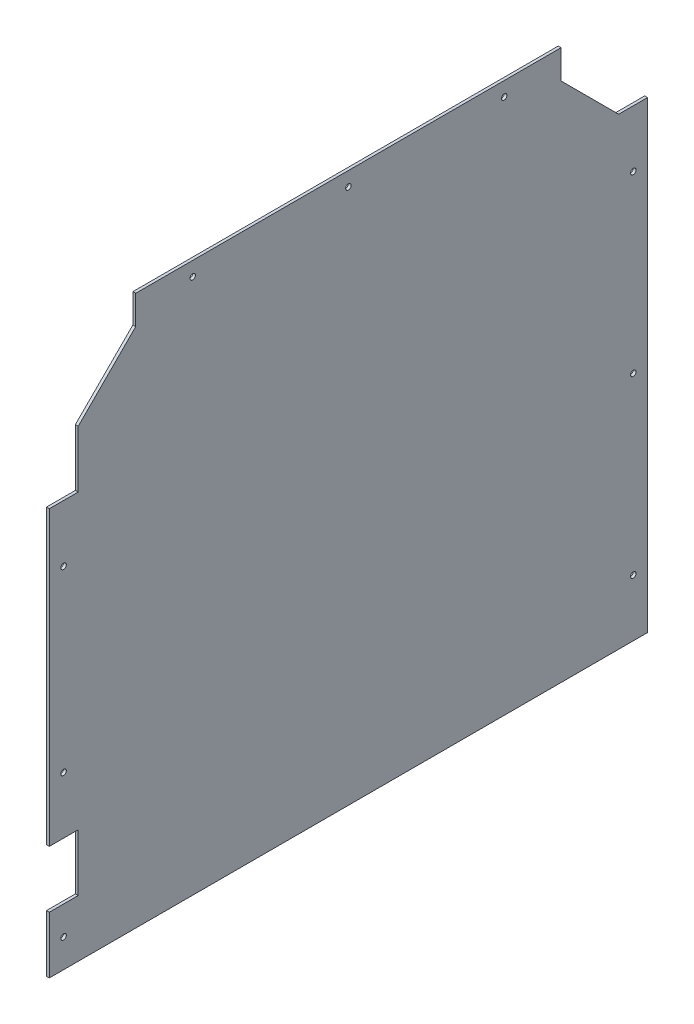
ISO-10303-21;
HEADER;
FILE_DESCRIPTION(('STEP AP214'),'2;1');
FILE_NAME('part.step','',(''),(''),'','','');
FILE_SCHEMA(('AUTOMOTIVE_DESIGN { 1 0 10303 214 1 1 1 1 }'));
ENDSEC;
DATA;
#1=APPLICATION_CONTEXT('core data for automotive mechanical design processes');
#2=APPLICATION_PROTOCOL_DEFINITION('international standard','automotive_design',2000,#1);
#3=PRODUCT_CONTEXT('',#1,'mechanical');
#4=PRODUCT('Part','Part','',(#3));
#5=PRODUCT_RELATED_PRODUCT_CATEGORY('part','',(#4));
#6=PRODUCT_DEFINITION_FORMATION('','',#4);
#7=PRODUCT_DEFINITION_CONTEXT('part definition',#1,'design');
#8=PRODUCT_DEFINITION('design','',#6,#7);
#9=PRODUCT_DEFINITION_SHAPE('','',#8);
#10=(LENGTH_UNIT() NAMED_UNIT(*) SI_UNIT(.MILLI.,.METRE.));
#11=(NAMED_UNIT(*) PLANE_ANGLE_UNIT() SI_UNIT($,.RADIAN.));
#12=(NAMED_UNIT(*) SI_UNIT($,.STERADIAN.) SOLID_ANGLE_UNIT());
#13=UNCERTAINTY_MEASURE_WITH_UNIT(LENGTH_MEASURE(1.E-05),#10,'distance_accuracy_value','');
#14=(GEOMETRIC_REPRESENTATION_CONTEXT(3) GLOBAL_UNCERTAINTY_ASSIGNED_CONTEXT((#13)) GLOBAL_UNIT_ASSIGNED_CONTEXT((#10,
#11,#12)) REPRESENTATION_CONTEXT('',''));
#15=CARTESIAN_POINT('',(0.,0.,0.));
#16=DIRECTION('',(0.,0.,1.));
#17=DIRECTION('',(1.,0.,0.));
#18=AXIS2_PLACEMENT_3D('',#15,#16,#17);
#19=CARTESIAN_POINT('',(1.5,-289.5,315.));
#20=DIRECTION('',(0.,0.,-1.));
#21=DIRECTION('',(-1.,0.,0.));
#22=AXIS2_PLACEMENT_3D('',#19,#20,#21);
#23=PLANE('',#22);
#24=DIRECTION('',(0.,-1.,0.));
#25=VECTOR('',#24,1.);
#26=CARTESIAN_POINT('',(1.5,-289.5,315.));
#27=LINE('',#26,#25);
#28=CARTESIAN_POINT('',(1.5,-229.5,315.));
#29=VERTEX_POINT('',#28);
#30=CARTESIAN_POINT('',(1.5,-289.5,315.));
#31=VERTEX_POINT('',#30);
#32=EDGE_CURVE('E239',#29,#31,#27,.T.);
#33=ORIENTED_EDGE('',*,*,#32,.F.);
#34=DIRECTION('',(-1.,0.,0.));
#35=VECTOR('',#34,1.);
#36=CARTESIAN_POINT('',(1.5,-229.5,315.));
#37=LINE('',#36,#35);
#38=CARTESIAN_POINT('',(-1.5,-229.5,315.));
#39=VERTEX_POINT('',#38);
#40=EDGE_CURVE('E173',#29,#39,#37,.T.);
#41=ORIENTED_EDGE('',*,*,#40,.T.);
#42=DIRECTION('',(0.,-1.,0.));
#43=VECTOR('',#42,1.);
#44=CARTESIAN_POINT('',(-1.5,-289.5,315.));
#45=LINE('',#44,#43);
#46=CARTESIAN_POINT('',(-1.5,-289.5,315.));
#47=VERTEX_POINT('',#46);
#48=EDGE_CURVE('E220',#39,#47,#45,.T.);
#49=ORIENTED_EDGE('',*,*,#48,.T.);
#50=DIRECTION('',(-1.,0.,0.));
#51=VECTOR('',#50,1.);
#52=CARTESIAN_POINT('',(1.5,-289.5,315.));
#53=LINE('',#52,#51);
#54=EDGE_CURVE('E11',#31,#47,#53,.T.);
#55=ORIENTED_EDGE('',*,*,#54,.F.);
#56=EDGE_LOOP('',(#33,#41,#49,#55));
#57=FACE_BOUND('',#56,.T.);
#58=ADVANCED_FACE('F33',(#57),#23,.F.);
#59=CARTESIAN_POINT('',(1.5,138.5,315.));
#60=VERTEX_POINT('',#59);
#61=CARTESIAN_POINT('',(1.5,-169.5,315.));
#62=VERTEX_POINT('',#61);
#63=EDGE_CURVE('E241',#60,#62,#27,.T.);
#64=ORIENTED_EDGE('',*,*,#63,.F.);
#65=DIRECTION('',(-1.,0.,0.));
#66=VECTOR('',#65,1.);
#67=CARTESIAN_POINT('',(1.5,138.5,315.));
#68=LINE('',#67,#66);
#69=CARTESIAN_POINT('',(-1.5,138.5,315.));
#70=VERTEX_POINT('',#69);
#71=EDGE_CURVE('E151',#60,#70,#68,.T.);
#72=ORIENTED_EDGE('',*,*,#71,.T.);
#73=CARTESIAN_POINT('',(-1.5,-169.5,315.));
#74=VERTEX_POINT('',#73);
#75=EDGE_CURVE('E252',#70,#74,#45,.T.);
#76=ORIENTED_EDGE('',*,*,#75,.T.);
#77=DIRECTION('',(-1.,0.,0.));
#78=VECTOR('',#77,1.);
#79=CARTESIAN_POINT('',(1.5,-169.5,315.));
#80=LINE('',#79,#78);
#81=EDGE_CURVE('E48',#62,#74,#80,.T.);
#82=ORIENTED_EDGE('',*,*,#81,.F.);
#83=EDGE_LOOP('',(#64,#72,#76,#82));
#84=FACE_BOUND('',#83,.T.);
#85=ADVANCED_FACE('F35',(#84),#23,.F.);
#86=CARTESIAN_POINT('',(1.5,-289.5,-315.));
#87=DIRECTION('',(0.,1.,0.));
#88=DIRECTION('',(0.,0.,1.));
#89=AXIS2_PLACEMENT_3D('',#86,#87,#88);
#90=PLANE('',#89);
#91=DIRECTION('',(0.,0.,-1.));
#92=VECTOR('',#91,1.);
#93=CARTESIAN_POINT('',(-1.5,-289.5,-315.));
#94=LINE('',#93,#92);
#95=CARTESIAN_POINT('',(-1.5,-289.5,-315.));
#96=VERTEX_POINT('',#95);
#97=EDGE_CURVE('E253',#47,#96,#94,.T.);
#98=ORIENTED_EDGE('',*,*,#97,.T.);
#99=DIRECTION('',(-1.,0.,0.));
#100=VECTOR('',#99,1.);
#101=CARTESIAN_POINT('',(1.5,-289.5,-315.));
#102=LINE('',#101,#100);
#103=CARTESIAN_POINT('',(1.5,-289.5,-315.));
#104=VERTEX_POINT('',#103);
#105=EDGE_CURVE('E41',#104,#96,#102,.T.);
#106=ORIENTED_EDGE('',*,*,#105,.F.);
#107=DIRECTION('',(0.,0.,-1.));
#108=VECTOR('',#107,1.);
#109=CARTESIAN_POINT('',(1.5,-289.5,-315.));
#110=LINE('',#109,#108);
#111=EDGE_CURVE('E243',#31,#104,#110,.T.);
#112=ORIENTED_EDGE('',*,*,#111,.F.);
#113=ORIENTED_EDGE('',*,*,#54,.T.);
#114=EDGE_LOOP('',(#98,#106,#112,#113));
#115=FACE_BOUND('',#114,.T.);
#116=ADVANCED_FACE('F280',(#115),#90,.F.);
#117=CARTESIAN_POINT('',(1.5,-289.5,-315.));
#118=DIRECTION('',(0.,0.,1.));
#119=DIRECTION('',(1.,0.,0.));
#120=AXIS2_PLACEMENT_3D('',#117,#118,#119);
#121=PLANE('',#120);
#122=DIRECTION('',(0.,1.,0.));
#123=VECTOR('',#122,1.);
#124=CARTESIAN_POINT('',(-1.5,-289.5,-315.));
#125=LINE('',#124,#123);
#126=CARTESIAN_POINT('',(-1.5,198.5,-315.));
#127=VERTEX_POINT('',#126);
#128=EDGE_CURVE('E255',#96,#127,#125,.T.);
#129=ORIENTED_EDGE('',*,*,#128,.T.);
#130=DIRECTION('',(-1.,0.,0.));
#131=VECTOR('',#130,1.);
#132=CARTESIAN_POINT('',(1.5,198.5,-315.));
#133=LINE('',#132,#131);
#134=CARTESIAN_POINT('',(1.5,198.5,-315.));
#135=VERTEX_POINT('',#134);
#136=EDGE_CURVE('E56',#135,#127,#133,.T.);
#137=ORIENTED_EDGE('',*,*,#136,.F.);
#138=DIRECTION('',(0.,1.,0.));
#139=VECTOR('',#138,1.);
#140=CARTESIAN_POINT('',(1.5,-289.5,-315.));
#141=LINE('',#140,#139);
#142=EDGE_CURVE('E245',#104,#135,#141,.T.);
#143=ORIENTED_EDGE('',*,*,#142,.F.);
#144=ORIENTED_EDGE('',*,*,#105,.T.);
#145=EDGE_LOOP('',(#129,#137,#143,#144));
#146=FACE_BOUND('',#145,.T.);
#147=ADVANCED_FACE('F264',(#146),#121,.F.);
#148=CARTESIAN_POINT('',(1.5,289.5,-315.));
#149=DIRECTION('',(0.,-1.,0.));
#150=DIRECTION('',(0.,0.,-1.));
#151=AXIS2_PLACEMENT_3D('',#148,#149,#150);
#152=PLANE('',#151);
#153=DIRECTION('',(0.,0.,1.));
#154=VECTOR('',#153,1.);
#155=CARTESIAN_POINT('',(1.5,289.5,-315.));
#156=LINE('',#155,#154);
#157=CARTESIAN_POINT('',(1.5,289.5,-224.));
#158=VERTEX_POINT('',#157);
#159=CARTESIAN_POINT('',(1.5,289.5,224.));
#160=VERTEX_POINT('',#159);
#161=EDGE_CURVE('E248',#158,#160,#156,.T.);
#162=ORIENTED_EDGE('',*,*,#161,.F.);
#163=DIRECTION('',(-1.,0.,0.));
#164=VECTOR('',#163,1.);
#165=CARTESIAN_POINT('',(1.5,289.5,-224.));
#166=LINE('',#165,#164);
#167=CARTESIAN_POINT('',(-1.5,289.5,-224.));
#168=VERTEX_POINT('',#167);
#169=EDGE_CURVE('E217',#158,#168,#166,.T.);
#170=ORIENTED_EDGE('',*,*,#169,.T.);
#171=DIRECTION('',(0.,0.,1.));
#172=VECTOR('',#171,1.);
#173=CARTESIAN_POINT('',(-1.5,289.5,-315.));
#174=LINE('',#173,#172);
#175=CARTESIAN_POINT('',(-1.5,289.5,224.));
#176=VERTEX_POINT('',#175);
#177=EDGE_CURVE('E242',#168,#176,#174,.T.);
#178=ORIENTED_EDGE('',*,*,#177,.T.);
#179=DIRECTION('',(-1.,0.,0.));
#180=VECTOR('',#179,1.);
#181=CARTESIAN_POINT('',(1.5,289.5,224.));
#182=LINE('',#181,#180);
#183=EDGE_CURVE('E230',#160,#176,#182,.T.);
#184=ORIENTED_EDGE('',*,*,#183,.F.);
#185=EDGE_LOOP('',(#162,#170,#178,#184));
#186=FACE_BOUND('',#185,.T.);
#187=ADVANCED_FACE('F378',(#186),#152,.F.);
#188=CARTESIAN_POINT('',(1.5,0.,0.));
#189=DIRECTION('',(1.,0.,0.));
#190=DIRECTION('',(0.,0.,-1.));
#191=AXIS2_PLACEMENT_3D('',#188,#189,#190);
#192=PLANE('',#191);
#193=CARTESIAN_POINT('',(1.5,274.5,-164.));
#194=DIRECTION('',(-1.,0.,0.));
#195=DIRECTION('',(0.,0.,1.));
#196=AXIS2_PLACEMENT_3D('',#193,#194,#195);
#197=CIRCLE('',#196,2.90000000000001);
#198=CARTESIAN_POINT('',(1.5,274.5,-161.1));
#199=VERTEX_POINT('',#198);
#200=EDGE_CURVE('E535',#199,#199,#197,.T.);
#201=ORIENTED_EDGE('',*,*,#200,.T.);
#202=EDGE_LOOP('',(#201));
#203=FACE_BOUND('',#202,.T.);
#204=CARTESIAN_POINT('',(1.5,274.5,0.));
#205=DIRECTION('',(-1.,0.,0.));
#206=DIRECTION('',(0.,0.,1.));
#207=AXIS2_PLACEMENT_3D('',#204,#205,#206);
#208=CIRCLE('',#207,2.90000000000001);
#209=CARTESIAN_POINT('',(1.5,274.5,2.90000000000001));
#210=VERTEX_POINT('',#209);
#211=EDGE_CURVE('E545',#210,#210,#208,.T.);
#212=ORIENTED_EDGE('',*,*,#211,.T.);
#213=EDGE_LOOP('',(#212));
#214=FACE_BOUND('',#213,.T.);
#215=CARTESIAN_POINT('',(1.5,274.5,164.));
#216=DIRECTION('',(-1.,0.,0.));
#217=DIRECTION('',(0.,0.,1.));
#218=AXIS2_PLACEMENT_3D('',#215,#216,#217);
#219=CIRCLE('',#218,2.90000000000001);
#220=CARTESIAN_POINT('',(1.5,274.5,166.9));
#221=VERTEX_POINT('',#220);
#222=EDGE_CURVE('E551',#221,#221,#219,.T.);
#223=ORIENTED_EDGE('',*,*,#222,.T.);
#224=EDGE_LOOP('',(#223));
#225=FACE_BOUND('',#224,.T.);
#226=CARTESIAN_POINT('',(1.5,78.4999999999999,300.));
#227=DIRECTION('',(-1.,0.,0.));
#228=DIRECTION('',(0.,0.,1.));
#229=AXIS2_PLACEMENT_3D('',#226,#227,#228);
#230=CIRCLE('',#229,2.9);
#231=CARTESIAN_POINT('',(1.5,78.4999999999999,302.9));
#232=VERTEX_POINT('',#231);
#233=EDGE_CURVE('E557',#232,#232,#230,.T.);
#234=ORIENTED_EDGE('',*,*,#233,.T.);
#235=EDGE_LOOP('',(#234));
#236=FACE_BOUND('',#235,.T.);
#237=CARTESIAN_POINT('',(1.5,-109.5,300.));
#238=DIRECTION('',(-1.,0.,0.));
#239=DIRECTION('',(0.,0.,1.));
#240=AXIS2_PLACEMENT_3D('',#237,#238,#239);
#241=CIRCLE('',#240,2.9);
#242=CARTESIAN_POINT('',(1.5,-109.5,302.9));
#243=VERTEX_POINT('',#242);
#244=EDGE_CURVE('E563',#243,#243,#241,.T.);
#245=ORIENTED_EDGE('',*,*,#244,.T.);
#246=EDGE_LOOP('',(#245));
#247=FACE_BOUND('',#246,.T.);
#248=CARTESIAN_POINT('',(1.5,-259.5,300.));
#249=DIRECTION('',(-1.,0.,0.));
#250=DIRECTION('',(0.,0.,1.));
#251=AXIS2_PLACEMENT_3D('',#248,#249,#250);
#252=CIRCLE('',#251,2.90000000000001);
#253=CARTESIAN_POINT('',(1.5,-259.5,302.9));
#254=VERTEX_POINT('',#253);
#255=EDGE_CURVE('E569',#254,#254,#252,.T.);
#256=ORIENTED_EDGE('',*,*,#255,.T.);
#257=EDGE_LOOP('',(#256));
#258=FACE_BOUND('',#257,.T.);
#259=CARTESIAN_POINT('',(1.5,-229.5,-300.));
#260=DIRECTION('',(-1.,0.,0.));
#261=DIRECTION('',(0.,0.,1.));
#262=AXIS2_PLACEMENT_3D('',#259,#260,#261);
#263=CIRCLE('',#262,2.89999999999999);
#264=CARTESIAN_POINT('',(1.5,-229.5,-297.1));
#265=VERTEX_POINT('',#264);
#266=EDGE_CURVE('E575',#265,#265,#263,.T.);
#267=ORIENTED_EDGE('',*,*,#266,.T.);
#268=EDGE_LOOP('',(#267));
#269=FACE_BOUND('',#268,.T.);
#270=CARTESIAN_POINT('',(1.5,-45.5,-300.));
#271=DIRECTION('',(-1.,0.,0.));
#272=DIRECTION('',(0.,0.,1.));
#273=AXIS2_PLACEMENT_3D('',#270,#271,#272);
#274=CIRCLE('',#273,2.9);
#275=CARTESIAN_POINT('',(1.5,-45.5,-297.1));
#276=VERTEX_POINT('',#275);
#277=EDGE_CURVE('E581',#276,#276,#274,.T.);
#278=ORIENTED_EDGE('',*,*,#277,.T.);
#279=EDGE_LOOP('',(#278));
#280=FACE_BOUND('',#279,.T.);
#281=CARTESIAN_POINT('',(1.5,138.5,-300.));
#282=DIRECTION('',(-1.,0.,0.));
#283=DIRECTION('',(0.,0.,1.));
#284=AXIS2_PLACEMENT_3D('',#281,#282,#283);
#285=CIRCLE('',#284,2.89999999999999);
#286=CARTESIAN_POINT('',(1.5,138.5,-297.1));
#287=VERTEX_POINT('',#286);
#288=EDGE_CURVE('E170',#287,#287,#285,.T.);
#289=ORIENTED_EDGE('',*,*,#288,.T.);
#290=EDGE_LOOP('',(#289));
#291=FACE_BOUND('',#290,.T.);
#292=DIRECTION('',(0.,-1.,0.));
#293=VECTOR('',#292,1.);
#294=CARTESIAN_POINT('',(1.5,198.5,284.585786437627));
#295=LINE('',#294,#293);
#296=CARTESIAN_POINT('',(1.5,198.5,284.585786437627));
#297=VERTEX_POINT('',#296);
#298=CARTESIAN_POINT('',(1.5,138.5,284.585786437627));
#299=VERTEX_POINT('',#298);
#300=EDGE_CURVE('E145',#297,#299,#295,.T.);
#301=ORIENTED_EDGE('',*,*,#300,.T.);
#302=DIRECTION('',(0.,0.,1.));
#303=VECTOR('',#302,1.);
#304=CARTESIAN_POINT('',(1.5,138.5,284.585786437627));
#305=LINE('',#304,#303);
#306=EDGE_CURVE('E152',#299,#60,#305,.T.);
#307=ORIENTED_EDGE('',*,*,#306,.T.);
#308=ORIENTED_EDGE('',*,*,#63,.T.);
#309=DIRECTION('',(0.,0.,-1.));
#310=VECTOR('',#309,1.);
#311=CARTESIAN_POINT('',(1.5,-169.5,315.));
#312=LINE('',#311,#310);
#313=CARTESIAN_POINT('',(1.5,-169.5,284.585786437627));
#314=VERTEX_POINT('',#313);
#315=EDGE_CURVE('E177',#62,#314,#312,.T.);
#316=ORIENTED_EDGE('',*,*,#315,.T.);
#317=DIRECTION('',(0.,-1.,0.));
#318=VECTOR('',#317,1.);
#319=CARTESIAN_POINT('',(1.5,-169.5,284.585786437627));
#320=LINE('',#319,#318);
#321=CARTESIAN_POINT('',(1.5,-229.5,284.585786437627));
#322=VERTEX_POINT('',#321);
#323=EDGE_CURVE('E180',#314,#322,#320,.T.);
#324=ORIENTED_EDGE('',*,*,#323,.T.);
#325=DIRECTION('',(0.,0.,1.));
#326=VECTOR('',#325,1.);
#327=CARTESIAN_POINT('',(1.5,-229.5,315.));
#328=LINE('',#327,#326);
#329=EDGE_CURVE('E184',#322,#29,#328,.T.);
#330=ORIENTED_EDGE('',*,*,#329,.T.);
#331=ORIENTED_EDGE('',*,*,#32,.T.);
#332=ORIENTED_EDGE('',*,*,#111,.T.);
#333=ORIENTED_EDGE('',*,*,#142,.T.);
#334=DIRECTION('',(0.,0.,1.));
#335=VECTOR('',#334,1.);
#336=CARTESIAN_POINT('',(1.5,198.5,-284.585786437627));
#337=LINE('',#336,#335);
#338=CARTESIAN_POINT('',(1.5,198.5,-284.585786437627));
#339=VERTEX_POINT('',#338);
#340=EDGE_CURVE('E200',#135,#339,#337,.T.);
#341=ORIENTED_EDGE('',*,*,#340,.T.);
#342=DIRECTION('',(0.,0.707106781186547,0.707106781186547));
#343=VECTOR('',#342,1.);
#344=CARTESIAN_POINT('',(1.5,259.085786437627,-224.));
#345=LINE('',#344,#343);
#346=CARTESIAN_POINT('',(1.5,259.085786437627,-224.));
#347=VERTEX_POINT('',#346);
#348=EDGE_CURVE('E203',#339,#347,#345,.T.);
#349=ORIENTED_EDGE('',*,*,#348,.T.);
#350=DIRECTION('',(0.,1.,0.));
#351=VECTOR('',#350,1.);
#352=CARTESIAN_POINT('',(1.5,289.5,-224.));
#353=LINE('',#352,#351);
#354=EDGE_CURVE('E207',#347,#158,#353,.T.);
#355=ORIENTED_EDGE('',*,*,#354,.T.);
#356=ORIENTED_EDGE('',*,*,#161,.T.);
#357=DIRECTION('',(0.,-1.,0.));
#358=VECTOR('',#357,1.);
#359=CARTESIAN_POINT('',(1.5,289.5,224.));
#360=LINE('',#359,#358);
#361=CARTESIAN_POINT('',(1.5,259.085786437627,224.));
#362=VERTEX_POINT('',#361);
#363=EDGE_CURVE('E226',#160,#362,#360,.T.);
#364=ORIENTED_EDGE('',*,*,#363,.T.);
#365=DIRECTION('',(0.,-0.707106781186547,0.707106781186548));
#366=VECTOR('',#365,1.);
#367=CARTESIAN_POINT('',(1.5,259.085786437627,224.));
#368=LINE('',#367,#366);
#369=EDGE_CURVE('E165',#362,#297,#368,.T.);
#370=ORIENTED_EDGE('',*,*,#369,.T.);
#371=EDGE_LOOP('',(#301,#307,#308,#316,#324,#330,#331,#332,#333,#341,#349,#355,#356,#364,#370));
#372=FACE_BOUND('',#371,.T.);
#373=ADVANCED_FACE('F162',(#203,#214,#225,#236,#247,#258,#269,#280,#291,#372),#192,.T.);
#374=CARTESIAN_POINT('',(-1.5,0.,0.));
#375=DIRECTION('',(1.,0.,0.));
#376=DIRECTION('',(0.,0.,-1.));
#377=AXIS2_PLACEMENT_3D('',#374,#375,#376);
#378=PLANE('',#377);
#379=CARTESIAN_POINT('',(-1.5,274.5,-164.));
#380=DIRECTION('',(-1.,0.,0.));
#381=DIRECTION('',(0.,0.,1.));
#382=AXIS2_PLACEMENT_3D('',#379,#380,#381);
#383=CIRCLE('',#382,2.90000000000001);
#384=CARTESIAN_POINT('',(-1.5,274.5,-161.1));
#385=VERTEX_POINT('',#384);
#386=EDGE_CURVE('E538',#385,#385,#383,.T.);
#387=ORIENTED_EDGE('',*,*,#386,.F.);
#388=EDGE_LOOP('',(#387));
#389=FACE_BOUND('',#388,.T.);
#390=CARTESIAN_POINT('',(-1.5,274.5,0.));
#391=DIRECTION('',(-1.,0.,0.));
#392=DIRECTION('',(0.,0.,1.));
#393=AXIS2_PLACEMENT_3D('',#390,#391,#392);
#394=CIRCLE('',#393,2.90000000000001);
#395=CARTESIAN_POINT('',(-1.5,274.5,2.90000000000001));
#396=VERTEX_POINT('',#395);
#397=EDGE_CURVE('E540',#396,#396,#394,.T.);
#398=ORIENTED_EDGE('',*,*,#397,.F.);
#399=EDGE_LOOP('',(#398));
#400=FACE_BOUND('',#399,.T.);
#401=CARTESIAN_POINT('',(-1.5,274.5,164.));
#402=DIRECTION('',(-1.,0.,0.));
#403=DIRECTION('',(0.,0.,1.));
#404=AXIS2_PLACEMENT_3D('',#401,#402,#403);
#405=CIRCLE('',#404,2.90000000000001);
#406=CARTESIAN_POINT('',(-1.5,274.5,166.9));
#407=VERTEX_POINT('',#406);
#408=EDGE_CURVE('E548',#407,#407,#405,.T.);
#409=ORIENTED_EDGE('',*,*,#408,.F.);
#410=EDGE_LOOP('',(#409));
#411=FACE_BOUND('',#410,.T.);
#412=CARTESIAN_POINT('',(-1.5,78.4999999999999,300.));
#413=DIRECTION('',(-1.,0.,0.));
#414=DIRECTION('',(0.,0.,1.));
#415=AXIS2_PLACEMENT_3D('',#412,#413,#414);
#416=CIRCLE('',#415,2.9);
#417=CARTESIAN_POINT('',(-1.5,78.4999999999999,302.9));
#418=VERTEX_POINT('',#417);
#419=EDGE_CURVE('E554',#418,#418,#416,.T.);
#420=ORIENTED_EDGE('',*,*,#419,.F.);
#421=EDGE_LOOP('',(#420));
#422=FACE_BOUND('',#421,.T.);
#423=CARTESIAN_POINT('',(-1.5,-109.5,300.));
#424=DIRECTION('',(-1.,0.,0.));
#425=DIRECTION('',(0.,0.,1.));
#426=AXIS2_PLACEMENT_3D('',#423,#424,#425);
#427=CIRCLE('',#426,2.9);
#428=CARTESIAN_POINT('',(-1.5,-109.5,302.9));
#429=VERTEX_POINT('',#428);
#430=EDGE_CURVE('E560',#429,#429,#427,.T.);
#431=ORIENTED_EDGE('',*,*,#430,.F.);
#432=EDGE_LOOP('',(#431));
#433=FACE_BOUND('',#432,.T.);
#434=CARTESIAN_POINT('',(-1.5,-259.5,300.));
#435=DIRECTION('',(-1.,0.,0.));
#436=DIRECTION('',(0.,0.,1.));
#437=AXIS2_PLACEMENT_3D('',#434,#435,#436);
#438=CIRCLE('',#437,2.90000000000001);
#439=CARTESIAN_POINT('',(-1.5,-259.5,302.9));
#440=VERTEX_POINT('',#439);
#441=EDGE_CURVE('E566',#440,#440,#438,.T.);
#442=ORIENTED_EDGE('',*,*,#441,.F.);
#443=EDGE_LOOP('',(#442));
#444=FACE_BOUND('',#443,.T.);
#445=CARTESIAN_POINT('',(-1.5,-229.5,-300.));
#446=DIRECTION('',(-1.,0.,0.));
#447=DIRECTION('',(0.,0.,1.));
#448=AXIS2_PLACEMENT_3D('',#445,#446,#447);
#449=CIRCLE('',#448,2.89999999999999);
#450=CARTESIAN_POINT('',(-1.5,-229.5,-297.1));
#451=VERTEX_POINT('',#450);
#452=EDGE_CURVE('E572',#451,#451,#449,.T.);
#453=ORIENTED_EDGE('',*,*,#452,.F.);
#454=EDGE_LOOP('',(#453));
#455=FACE_BOUND('',#454,.T.);
#456=CARTESIAN_POINT('',(-1.5,-45.5,-300.));
#457=DIRECTION('',(-1.,0.,0.));
#458=DIRECTION('',(0.,0.,1.));
#459=AXIS2_PLACEMENT_3D('',#456,#457,#458);
#460=CIRCLE('',#459,2.9);
#461=CARTESIAN_POINT('',(-1.5,-45.5,-297.1));
#462=VERTEX_POINT('',#461);
#463=EDGE_CURVE('E578',#462,#462,#460,.T.);
#464=ORIENTED_EDGE('',*,*,#463,.F.);
#465=EDGE_LOOP('',(#464));
#466=FACE_BOUND('',#465,.T.);
#467=CARTESIAN_POINT('',(-1.5,138.5,-300.));
#468=DIRECTION('',(-1.,0.,0.));
#469=DIRECTION('',(0.,0.,1.));
#470=AXIS2_PLACEMENT_3D('',#467,#468,#469);
#471=CIRCLE('',#470,2.89999999999999);
#472=CARTESIAN_POINT('',(-1.5,138.5,-297.1));
#473=VERTEX_POINT('',#472);
#474=EDGE_CURVE('E583',#473,#473,#471,.T.);
#475=ORIENTED_EDGE('',*,*,#474,.F.);
#476=EDGE_LOOP('',(#475));
#477=FACE_BOUND('',#476,.T.);
#478=DIRECTION('',(0.,0.,1.));
#479=VECTOR('',#478,1.);
#480=CARTESIAN_POINT('',(-1.5,138.5,284.585786437627));
#481=LINE('',#480,#479);
#482=CARTESIAN_POINT('',(-1.5,138.5,284.585786437627));
#483=VERTEX_POINT('',#482);
#484=EDGE_CURVE('E166',#483,#70,#481,.T.);
#485=ORIENTED_EDGE('',*,*,#484,.F.);
#486=DIRECTION('',(0.,-1.,0.));
#487=VECTOR('',#486,1.);
#488=CARTESIAN_POINT('',(-1.5,198.5,284.585786437627));
#489=LINE('',#488,#487);
#490=CARTESIAN_POINT('',(-1.5,198.5,284.585786437627));
#491=VERTEX_POINT('',#490);
#492=EDGE_CURVE('E148',#491,#483,#489,.T.);
#493=ORIENTED_EDGE('',*,*,#492,.F.);
#494=DIRECTION('',(0.,-0.707106781186547,0.707106781186548));
#495=VECTOR('',#494,1.);
#496=CARTESIAN_POINT('',(-1.5,259.085786437627,224.));
#497=LINE('',#496,#495);
#498=CARTESIAN_POINT('',(-1.5,259.085786437627,224.));
#499=VERTEX_POINT('',#498);
#500=EDGE_CURVE('E228',#499,#491,#497,.T.);
#501=ORIENTED_EDGE('',*,*,#500,.F.);
#502=DIRECTION('',(0.,-1.,0.));
#503=VECTOR('',#502,1.);
#504=CARTESIAN_POINT('',(-1.5,289.5,224.));
#505=LINE('',#504,#503);
#506=EDGE_CURVE('E175',#176,#499,#505,.T.);
#507=ORIENTED_EDGE('',*,*,#506,.F.);
#508=ORIENTED_EDGE('',*,*,#177,.F.);
#509=DIRECTION('',(0.,1.,0.));
#510=VECTOR('',#509,1.);
#511=CARTESIAN_POINT('',(-1.5,289.5,-224.));
#512=LINE('',#511,#510);
#513=CARTESIAN_POINT('',(-1.5,259.085786437627,-224.));
#514=VERTEX_POINT('',#513);
#515=EDGE_CURVE('E204',#514,#168,#512,.T.);
#516=ORIENTED_EDGE('',*,*,#515,.F.);
#517=DIRECTION('',(0.,0.707106781186547,0.707106781186547));
#518=VECTOR('',#517,1.);
#519=CARTESIAN_POINT('',(-1.5,259.085786437627,-224.));
#520=LINE('',#519,#518);
#521=CARTESIAN_POINT('',(-1.5,198.5,-284.585786437627));
#522=VERTEX_POINT('',#521);
#523=EDGE_CURVE('E212',#522,#514,#520,.T.);
#524=ORIENTED_EDGE('',*,*,#523,.F.);
#525=DIRECTION('',(0.,0.,1.));
#526=VECTOR('',#525,1.);
#527=CARTESIAN_POINT('',(-1.5,198.5,-284.585786437627));
#528=LINE('',#527,#526);
#529=EDGE_CURVE('E210',#127,#522,#528,.T.);
#530=ORIENTED_EDGE('',*,*,#529,.F.);
#531=ORIENTED_EDGE('',*,*,#128,.F.);
#532=ORIENTED_EDGE('',*,*,#97,.F.);
#533=ORIENTED_EDGE('',*,*,#48,.F.);
#534=DIRECTION('',(0.,0.,1.));
#535=VECTOR('',#534,1.);
#536=CARTESIAN_POINT('',(-1.5,-229.5,315.));
#537=LINE('',#536,#535);
#538=CARTESIAN_POINT('',(-1.5,-229.5,284.585786437627));
#539=VERTEX_POINT('',#538);
#540=EDGE_CURVE('E181',#539,#39,#537,.T.);
#541=ORIENTED_EDGE('',*,*,#540,.F.);
#542=DIRECTION('',(0.,-1.,0.));
#543=VECTOR('',#542,1.);
#544=CARTESIAN_POINT('',(-1.5,-169.5,284.585786437627));
#545=LINE('',#544,#543);
#546=CARTESIAN_POINT('',(-1.5,-169.5,284.585786437627));
#547=VERTEX_POINT('',#546);
#548=EDGE_CURVE('E189',#547,#539,#545,.T.);
#549=ORIENTED_EDGE('',*,*,#548,.F.);
#550=DIRECTION('',(0.,0.,-1.));
#551=VECTOR('',#550,1.);
#552=CARTESIAN_POINT('',(-1.5,-169.5,315.));
#553=LINE('',#552,#551);
#554=EDGE_CURVE('E187',#74,#547,#553,.T.);
#555=ORIENTED_EDGE('',*,*,#554,.F.);
#556=ORIENTED_EDGE('',*,*,#75,.F.);
#557=EDGE_LOOP('',(#485,#493,#501,#507,#508,#516,#524,#530,#531,#532,#533,#541,#549,#555,#556));
#558=FACE_BOUND('',#557,.T.);
#559=ADVANCED_FACE('F269',(#389,#400,#411,#422,#433,#444,#455,#466,#477,#558),#378,.F.);
#560=CARTESIAN_POINT('',(1.5,259.085786437627,224.));
#561=DIRECTION('',(0.,-0.707106781186548,-0.707106781186547));
#562=DIRECTION('',(0.,0.707106781186547,-0.707106781186548));
#563=AXIS2_PLACEMENT_3D('',#560,#561,#562);
#564=PLANE('',#563);
#565=ORIENTED_EDGE('',*,*,#500,.T.);
#566=DIRECTION('',(-1.,0.,0.));
#567=VECTOR('',#566,1.);
#568=CARTESIAN_POINT('',(1.5,198.5,284.585786437627));
#569=LINE('',#568,#567);
#570=EDGE_CURVE('E213',#297,#491,#569,.T.);
#571=ORIENTED_EDGE('',*,*,#570,.F.);
#572=ORIENTED_EDGE('',*,*,#369,.F.);
#573=DIRECTION('',(-1.,0.,0.));
#574=VECTOR('',#573,1.);
#575=CARTESIAN_POINT('',(1.5,259.085786437627,224.));
#576=LINE('',#575,#574);
#577=EDGE_CURVE('E236',#362,#499,#576,.T.);
#578=ORIENTED_EDGE('',*,*,#577,.T.);
#579=EDGE_LOOP('',(#565,#571,#572,#578));
#580=FACE_BOUND('',#579,.T.);
#581=ADVANCED_FACE('F317',(#580),#564,.F.);
#582=CARTESIAN_POINT('',(1.5,289.5,224.));
#583=DIRECTION('',(0.,0.,-1.));
#584=DIRECTION('',(-1.,0.,0.));
#585=AXIS2_PLACEMENT_3D('',#582,#583,#584);
#586=PLANE('',#585);
#587=ORIENTED_EDGE('',*,*,#506,.T.);
#588=ORIENTED_EDGE('',*,*,#577,.F.);
#589=ORIENTED_EDGE('',*,*,#363,.F.);
#590=ORIENTED_EDGE('',*,*,#183,.T.);
#591=EDGE_LOOP('',(#587,#588,#589,#590));
#592=FACE_BOUND('',#591,.T.);
#593=ADVANCED_FACE('F322',(#592),#586,.F.);
#594=CARTESIAN_POINT('',(1.5,289.5,-224.));
#595=DIRECTION('',(0.,0.,1.));
#596=DIRECTION('',(1.,0.,0.));
#597=AXIS2_PLACEMENT_3D('',#594,#595,#596);
#598=PLANE('',#597);
#599=ORIENTED_EDGE('',*,*,#515,.T.);
#600=ORIENTED_EDGE('',*,*,#169,.F.);
#601=ORIENTED_EDGE('',*,*,#354,.F.);
#602=DIRECTION('',(-1.,0.,0.));
#603=VECTOR('',#602,1.);
#604=CARTESIAN_POINT('',(1.5,259.085786437627,-224.));
#605=LINE('',#604,#603);
#606=EDGE_CURVE('E221',#347,#514,#605,.T.);
#607=ORIENTED_EDGE('',*,*,#606,.T.);
#608=EDGE_LOOP('',(#599,#600,#601,#607));
#609=FACE_BOUND('',#608,.T.);
#610=ADVANCED_FACE('F482',(#609),#598,.F.);
#611=CARTESIAN_POINT('',(1.5,259.085786437627,-224.));
#612=DIRECTION('',(0.,-0.707106781186548,0.707106781186548));
#613=DIRECTION('',(0.,-0.707106781186548,-0.707106781186548));
#614=AXIS2_PLACEMENT_3D('',#611,#612,#613);
#615=PLANE('',#614);
#616=ORIENTED_EDGE('',*,*,#523,.T.);
#617=ORIENTED_EDGE('',*,*,#606,.F.);
#618=ORIENTED_EDGE('',*,*,#348,.F.);
#619=DIRECTION('',(-1.,0.,0.));
#620=VECTOR('',#619,1.);
#621=CARTESIAN_POINT('',(1.5,198.5,-284.585786437627));
#622=LINE('',#621,#620);
#623=EDGE_CURVE('E223',#339,#522,#622,.T.);
#624=ORIENTED_EDGE('',*,*,#623,.T.);
#625=EDGE_LOOP('',(#616,#617,#618,#624));
#626=FACE_BOUND('',#625,.T.);
#627=ADVANCED_FACE('F276',(#626),#615,.F.);
#628=CARTESIAN_POINT('',(1.5,198.5,-284.585786437627));
#629=DIRECTION('',(0.,-1.,0.));
#630=DIRECTION('',(0.,0.,-1.));
#631=AXIS2_PLACEMENT_3D('',#628,#629,#630);
#632=PLANE('',#631);
#633=ORIENTED_EDGE('',*,*,#529,.T.);
#634=ORIENTED_EDGE('',*,*,#623,.F.);
#635=ORIENTED_EDGE('',*,*,#340,.F.);
#636=ORIENTED_EDGE('',*,*,#136,.T.);
#637=EDGE_LOOP('',(#633,#634,#635,#636));
#638=FACE_BOUND('',#637,.T.);
#639=ADVANCED_FACE('F273',(#638),#632,.F.);
#640=CARTESIAN_POINT('',(1.5,198.5,284.585786437627));
#641=DIRECTION('',(0.,0.,-1.));
#642=DIRECTION('',(-1.,0.,0.));
#643=AXIS2_PLACEMENT_3D('',#640,#641,#642);
#644=PLANE('',#643);
#645=ORIENTED_EDGE('',*,*,#492,.T.);
#646=DIRECTION('',(-1.,0.,0.));
#647=VECTOR('',#646,1.);
#648=CARTESIAN_POINT('',(1.5,138.5,284.585786437627));
#649=LINE('',#648,#647);
#650=EDGE_CURVE('E141',#299,#483,#649,.T.);
#651=ORIENTED_EDGE('',*,*,#650,.F.);
#652=ORIENTED_EDGE('',*,*,#300,.F.);
#653=ORIENTED_EDGE('',*,*,#570,.T.);
#654=EDGE_LOOP('',(#645,#651,#652,#653));
#655=FACE_BOUND('',#654,.T.);
#656=ADVANCED_FACE('F143',(#655),#644,.F.);
#657=CARTESIAN_POINT('',(1.5,138.5,284.585786437627));
#658=DIRECTION('',(0.,-1.,0.));
#659=DIRECTION('',(0.,0.,-1.));
#660=AXIS2_PLACEMENT_3D('',#657,#658,#659);
#661=PLANE('',#660);
#662=ORIENTED_EDGE('',*,*,#484,.T.);
#663=ORIENTED_EDGE('',*,*,#71,.F.);
#664=ORIENTED_EDGE('',*,*,#306,.F.);
#665=ORIENTED_EDGE('',*,*,#650,.T.);
#666=EDGE_LOOP('',(#662,#663,#664,#665));
#667=FACE_BOUND('',#666,.T.);
#668=ADVANCED_FACE('F155',(#667),#661,.F.);
#669=CARTESIAN_POINT('',(1.5,-229.5,315.));
#670=DIRECTION('',(0.,-1.,0.));
#671=DIRECTION('',(0.,0.,-1.));
#672=AXIS2_PLACEMENT_3D('',#669,#670,#671);
#673=PLANE('',#672);
#674=ORIENTED_EDGE('',*,*,#540,.T.);
#675=ORIENTED_EDGE('',*,*,#40,.F.);
#676=ORIENTED_EDGE('',*,*,#329,.F.);
#677=DIRECTION('',(-1.,0.,0.));
#678=VECTOR('',#677,1.);
#679=CARTESIAN_POINT('',(1.5,-229.5,284.585786437627));
#680=LINE('',#679,#678);
#681=EDGE_CURVE('E195',#322,#539,#680,.T.);
#682=ORIENTED_EDGE('',*,*,#681,.T.);
#683=EDGE_LOOP('',(#674,#675,#676,#682));
#684=FACE_BOUND('',#683,.T.);
#685=ADVANCED_FACE('F285',(#684),#673,.F.);
#686=CARTESIAN_POINT('',(1.5,-169.5,284.585786437627));
#687=DIRECTION('',(0.,0.,-1.));
#688=DIRECTION('',(-1.,0.,0.));
#689=AXIS2_PLACEMENT_3D('',#686,#687,#688);
#690=PLANE('',#689);
#691=ORIENTED_EDGE('',*,*,#548,.T.);
#692=ORIENTED_EDGE('',*,*,#681,.F.);
#693=ORIENTED_EDGE('',*,*,#323,.F.);
#694=DIRECTION('',(-1.,0.,0.));
#695=VECTOR('',#694,1.);
#696=CARTESIAN_POINT('',(1.5,-169.5,284.585786437627));
#697=LINE('',#696,#695);
#698=EDGE_CURVE('E197',#314,#547,#697,.T.);
#699=ORIENTED_EDGE('',*,*,#698,.T.);
#700=EDGE_LOOP('',(#691,#692,#693,#699));
#701=FACE_BOUND('',#700,.T.);
#702=ADVANCED_FACE('F289',(#701),#690,.F.);
#703=CARTESIAN_POINT('',(1.5,-169.5,315.));
#704=DIRECTION('',(0.,1.,0.));
#705=DIRECTION('',(0.,0.,1.));
#706=AXIS2_PLACEMENT_3D('',#703,#704,#705);
#707=PLANE('',#706);
#708=ORIENTED_EDGE('',*,*,#554,.T.);
#709=ORIENTED_EDGE('',*,*,#698,.F.);
#710=ORIENTED_EDGE('',*,*,#315,.F.);
#711=ORIENTED_EDGE('',*,*,#81,.T.);
#712=EDGE_LOOP('',(#708,#709,#710,#711));
#713=FACE_BOUND('',#712,.T.);
#714=ADVANCED_FACE('F290',(#713),#707,.F.);
#715=CARTESIAN_POINT('',(-1.5,138.5,-300.));
#716=DIRECTION('',(-1.,0.,0.));
#717=DIRECTION('',(0.,0.,1.));
#718=AXIS2_PLACEMENT_3D('',#715,#716,#717);
#719=CYLINDRICAL_SURFACE('',#718,2.89999999999999);
#720=ORIENTED_EDGE('',*,*,#288,.F.);
#721=EDGE_LOOP('',(#720));
#722=FACE_BOUND('',#721,.T.);
#723=ORIENTED_EDGE('',*,*,#474,.T.);
#724=EDGE_LOOP('',(#723));
#725=FACE_BOUND('',#724,.T.);
#726=ADVANCED_FACE('F367',(#722,#725),#719,.F.);
#727=CARTESIAN_POINT('',(-1.5,-45.5,-300.));
#728=DIRECTION('',(-1.,0.,0.));
#729=DIRECTION('',(0.,0.,1.));
#730=AXIS2_PLACEMENT_3D('',#727,#728,#729);
#731=CYLINDRICAL_SURFACE('',#730,2.9);
#732=ORIENTED_EDGE('',*,*,#277,.F.);
#733=EDGE_LOOP('',(#732));
#734=FACE_BOUND('',#733,.T.);
#735=ORIENTED_EDGE('',*,*,#463,.T.);
#736=EDGE_LOOP('',(#735));
#737=FACE_BOUND('',#736,.T.);
#738=ADVANCED_FACE('F395',(#734,#737),#731,.F.);
#739=CARTESIAN_POINT('',(-1.5,-229.5,-300.));
#740=DIRECTION('',(-1.,0.,0.));
#741=DIRECTION('',(0.,0.,1.));
#742=AXIS2_PLACEMENT_3D('',#739,#740,#741);
#743=CYLINDRICAL_SURFACE('',#742,2.89999999999999);
#744=ORIENTED_EDGE('',*,*,#266,.F.);
#745=EDGE_LOOP('',(#744));
#746=FACE_BOUND('',#745,.T.);
#747=ORIENTED_EDGE('',*,*,#452,.T.);
#748=EDGE_LOOP('',(#747));
#749=FACE_BOUND('',#748,.T.);
#750=ADVANCED_FACE('F405',(#746,#749),#743,.F.);
#751=CARTESIAN_POINT('',(-1.5,-259.5,300.));
#752=DIRECTION('',(-1.,0.,0.));
#753=DIRECTION('',(0.,0.,1.));
#754=AXIS2_PLACEMENT_3D('',#751,#752,#753);
#755=CYLINDRICAL_SURFACE('',#754,2.90000000000001);
#756=ORIENTED_EDGE('',*,*,#255,.F.);
#757=EDGE_LOOP('',(#756));
#758=FACE_BOUND('',#757,.T.);
#759=ORIENTED_EDGE('',*,*,#441,.T.);
#760=EDGE_LOOP('',(#759));
#761=FACE_BOUND('',#760,.T.);
#762=ADVANCED_FACE('F415',(#758,#761),#755,.F.);
#763=CARTESIAN_POINT('',(-1.5,-109.5,300.));
#764=DIRECTION('',(-1.,0.,0.));
#765=DIRECTION('',(0.,0.,1.));
#766=AXIS2_PLACEMENT_3D('',#763,#764,#765);
#767=CYLINDRICAL_SURFACE('',#766,2.9);
#768=ORIENTED_EDGE('',*,*,#244,.F.);
#769=EDGE_LOOP('',(#768));
#770=FACE_BOUND('',#769,.T.);
#771=ORIENTED_EDGE('',*,*,#430,.T.);
#772=EDGE_LOOP('',(#771));
#773=FACE_BOUND('',#772,.T.);
#774=ADVANCED_FACE('F425',(#770,#773),#767,.F.);
#775=CARTESIAN_POINT('',(-1.5,78.4999999999999,300.));
#776=DIRECTION('',(-1.,0.,0.));
#777=DIRECTION('',(0.,0.,1.));
#778=AXIS2_PLACEMENT_3D('',#775,#776,#777);
#779=CYLINDRICAL_SURFACE('',#778,2.9);
#780=ORIENTED_EDGE('',*,*,#233,.F.);
#781=EDGE_LOOP('',(#780));
#782=FACE_BOUND('',#781,.T.);
#783=ORIENTED_EDGE('',*,*,#419,.T.);
#784=EDGE_LOOP('',(#783));
#785=FACE_BOUND('',#784,.T.);
#786=ADVANCED_FACE('F435',(#782,#785),#779,.F.);
#787=CARTESIAN_POINT('',(-1.5,274.5,164.));
#788=DIRECTION('',(-1.,0.,0.));
#789=DIRECTION('',(0.,0.,1.));
#790=AXIS2_PLACEMENT_3D('',#787,#788,#789);
#791=CYLINDRICAL_SURFACE('',#790,2.90000000000001);
#792=ORIENTED_EDGE('',*,*,#222,.F.);
#793=EDGE_LOOP('',(#792));
#794=FACE_BOUND('',#793,.T.);
#795=ORIENTED_EDGE('',*,*,#408,.T.);
#796=EDGE_LOOP('',(#795));
#797=FACE_BOUND('',#796,.T.);
#798=ADVANCED_FACE('F445',(#794,#797),#791,.F.);
#799=CARTESIAN_POINT('',(-1.5,274.5,0.));
#800=DIRECTION('',(-1.,0.,0.));
#801=DIRECTION('',(0.,0.,1.));
#802=AXIS2_PLACEMENT_3D('',#799,#800,#801);
#803=CYLINDRICAL_SURFACE('',#802,2.90000000000001);
#804=ORIENTED_EDGE('',*,*,#211,.F.);
#805=EDGE_LOOP('',(#804));
#806=FACE_BOUND('',#805,.T.);
#807=ORIENTED_EDGE('',*,*,#397,.T.);
#808=EDGE_LOOP('',(#807));
#809=FACE_BOUND('',#808,.T.);
#810=ADVANCED_FACE('F455',(#806,#809),#803,.F.);
#811=CARTESIAN_POINT('',(-1.5,274.5,-164.));
#812=DIRECTION('',(-1.,0.,0.));
#813=DIRECTION('',(0.,0.,1.));
#814=AXIS2_PLACEMENT_3D('',#811,#812,#813);
#815=CYLINDRICAL_SURFACE('',#814,2.90000000000001);
#816=ORIENTED_EDGE('',*,*,#200,.F.);
#817=EDGE_LOOP('',(#816));
#818=FACE_BOUND('',#817,.T.);
#819=ORIENTED_EDGE('',*,*,#386,.T.);
#820=EDGE_LOOP('',(#819));
#821=FACE_BOUND('',#820,.T.);
#822=ADVANCED_FACE('F465',(#818,#821),#815,.F.);
#823=CLOSED_SHELL('',(#58,#85,#116,#147,#187,#373,#559,#581,#593,#610,#627,#639,#656,#668,#685,
#702,#714,#726,#738,#750,#762,#774,#786,#798,#810,#822));
#824=MANIFOLD_SOLID_BREP('B2',#823);
#825=ADVANCED_BREP_SHAPE_REPRESENTATION('',(#18,#824),#14);
#826=SHAPE_DEFINITION_REPRESENTATION(#9,#825);
ENDSEC;
END-ISO-10303-21;
